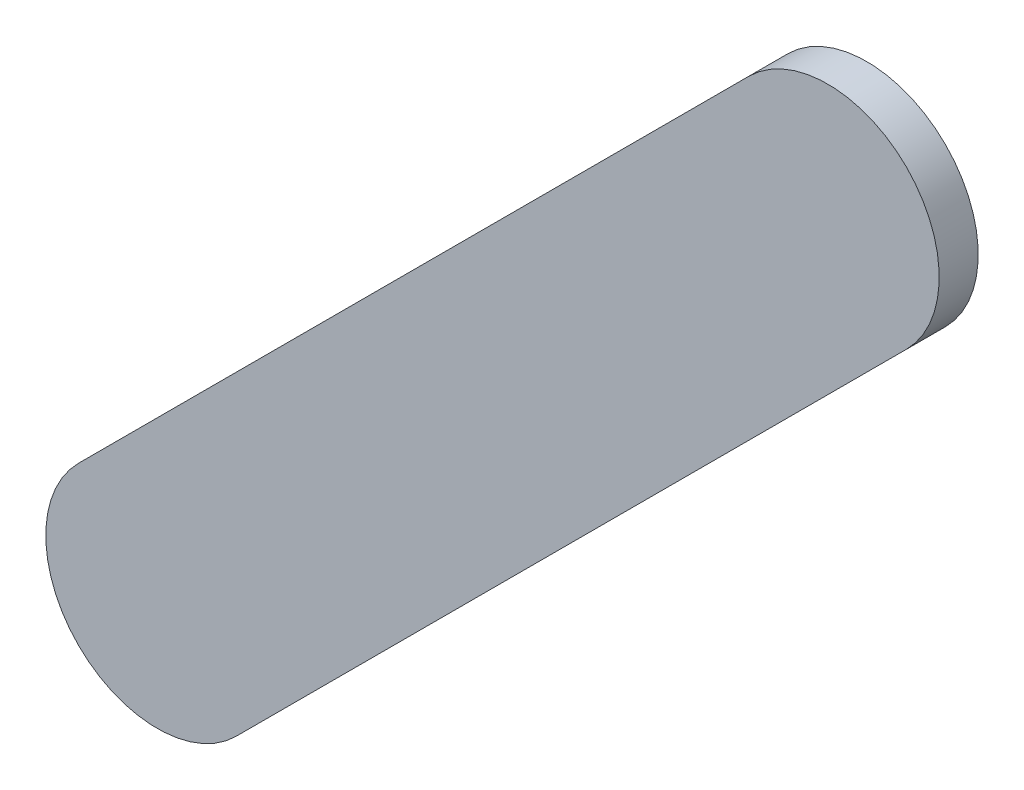
ISO-10303-21;
HEADER;
FILE_DESCRIPTION(('STEP AP214'),'2;1');
FILE_NAME('part.step','',(''),(''),'','','');
FILE_SCHEMA(('AUTOMOTIVE_DESIGN { 1 0 10303 214 1 1 1 1 }'));
ENDSEC;
DATA;
#1=APPLICATION_CONTEXT('core data for automotive mechanical design processes');
#2=APPLICATION_PROTOCOL_DEFINITION('international standard','automotive_design',2000,#1);
#3=PRODUCT_CONTEXT('',#1,'mechanical');
#4=PRODUCT('Part','Part','',(#3));
#5=PRODUCT_RELATED_PRODUCT_CATEGORY('part','',(#4));
#6=PRODUCT_DEFINITION_FORMATION('','',#4);
#7=PRODUCT_DEFINITION_CONTEXT('part definition',#1,'design');
#8=PRODUCT_DEFINITION('design','',#6,#7);
#9=PRODUCT_DEFINITION_SHAPE('','',#8);
#10=(LENGTH_UNIT() NAMED_UNIT(*) SI_UNIT(.MILLI.,.METRE.));
#11=(NAMED_UNIT(*) PLANE_ANGLE_UNIT() SI_UNIT($,.RADIAN.));
#12=(NAMED_UNIT(*) SI_UNIT($,.STERADIAN.) SOLID_ANGLE_UNIT());
#13=UNCERTAINTY_MEASURE_WITH_UNIT(LENGTH_MEASURE(1.E-05),#10,'distance_accuracy_value','');
#14=(GEOMETRIC_REPRESENTATION_CONTEXT(3) GLOBAL_UNCERTAINTY_ASSIGNED_CONTEXT((#13)) GLOBAL_UNIT_ASSIGNED_CONTEXT((#10,
#11,#12)) REPRESENTATION_CONTEXT('',''));
#15=CARTESIAN_POINT('',(0.,0.,0.));
#16=DIRECTION('',(0.,0.,1.));
#17=DIRECTION('',(1.,0.,0.));
#18=AXIS2_PLACEMENT_3D('',#15,#16,#17);
#19=CARTESIAN_POINT('',(92.919238,-124.254415,1.635));
#20=DIRECTION('',(0.,0.,1.));
#21=DIRECTION('',(1.,0.,0.));
#22=AXIS2_PLACEMENT_3D('',#19,#20,#21);
#23=PLANE('',#22);
#24=DIRECTION('',(0.707106781186548,0.707106781186548,0.));
#25=VECTOR('',#24,1.);
#26=CARTESIAN_POINT('',(92.919238,-124.254415,1.635));
#27=LINE('',#26,#25);
#28=CARTESIAN_POINT('',(92.919238,-124.254415,1.635));
#29=VERTEX_POINT('',#28);
#30=CARTESIAN_POINT('',(93.52071,-123.652943,1.635));
#31=VERTEX_POINT('',#30);
#32=EDGE_CURVE('E72',#29,#31,#27,.T.);
#33=ORIENTED_EDGE('',*,*,#32,.T.);
#34=CARTESIAN_POINT('',(93.4499995,-123.5822325,1.635));
#35=DIRECTION('',(0.,0.,1.));
#36=DIRECTION('',(0.707106781187048,-0.707106781186048,0.));
#37=AXIS2_PLACEMENT_3D('',#34,#35,#36);
#38=CIRCLE('',#37,0.09999974810218);
#39=CARTESIAN_POINT('',(93.379289,-123.511522,1.635));
#40=VERTEX_POINT('',#39);
#41=EDGE_CURVE('E70',#31,#40,#38,.T.);
#42=ORIENTED_EDGE('',*,*,#41,.T.);
#43=DIRECTION('',(-0.707106781186548,-0.707106781186548,0.));
#44=VECTOR('',#43,1.);
#45=CARTESIAN_POINT('',(93.379289,-123.511522,1.635));
#46=LINE('',#45,#44);
#47=CARTESIAN_POINT('',(92.777817,-124.112994,1.635));
#48=VERTEX_POINT('',#47);
#49=EDGE_CURVE('E20',#40,#48,#46,.T.);
#50=ORIENTED_EDGE('',*,*,#49,.T.);
#51=CARTESIAN_POINT('',(92.8485275,-124.1837045,1.635));
#52=DIRECTION('',(0.,0.,1.));
#53=DIRECTION('',(-0.707106781186548,0.707106781186548,0.));
#54=AXIS2_PLACEMENT_3D('',#51,#52,#53);
#55=CIRCLE('',#54,0.09999974810218);
#56=EDGE_CURVE('E11',#48,#29,#55,.T.);
#57=ORIENTED_EDGE('',*,*,#56,.T.);
#58=EDGE_LOOP('',(#33,#42,#50,#57));
#59=FACE_BOUND('',#58,.T.);
#60=ADVANCED_FACE('F17',(#59),#23,.T.);
#61=CARTESIAN_POINT('',(92.919238,-124.254415,1.6));
#62=DIRECTION('',(0.,0.,1.));
#63=DIRECTION('',(1.,0.,0.));
#64=AXIS2_PLACEMENT_3D('',#61,#62,#63);
#65=PLANE('',#64);
#66=CARTESIAN_POINT('',(92.8485275,-124.1837045,1.6));
#67=DIRECTION('',(0.,0.,1.));
#68=DIRECTION('',(-0.707106781186548,0.707106781186548,0.));
#69=AXIS2_PLACEMENT_3D('',#66,#67,#68);
#70=CIRCLE('',#69,0.09999974810218);
#71=CARTESIAN_POINT('',(92.777817,-124.112994,1.6));
#72=VERTEX_POINT('',#71);
#73=CARTESIAN_POINT('',(92.919238,-124.254415,1.6));
#74=VERTEX_POINT('',#73);
#75=EDGE_CURVE('E27',#72,#74,#70,.T.);
#76=ORIENTED_EDGE('',*,*,#75,.F.);
#77=DIRECTION('',(-0.707106781186548,-0.707106781186548,0.));
#78=VECTOR('',#77,1.);
#79=CARTESIAN_POINT('',(93.379289,-123.511522,1.6));
#80=LINE('',#79,#78);
#81=CARTESIAN_POINT('',(93.379289,-123.511522,1.6));
#82=VERTEX_POINT('',#81);
#83=EDGE_CURVE('E77',#82,#72,#80,.T.);
#84=ORIENTED_EDGE('',*,*,#83,.F.);
#85=CARTESIAN_POINT('',(93.4499995,-123.5822325,1.6));
#86=DIRECTION('',(0.,0.,1.));
#87=DIRECTION('',(0.707106781187048,-0.707106781186048,0.));
#88=AXIS2_PLACEMENT_3D('',#85,#86,#87);
#89=CIRCLE('',#88,0.09999974810218);
#90=CARTESIAN_POINT('',(93.52071,-123.652943,1.6));
#91=VERTEX_POINT('',#90);
#92=EDGE_CURVE('E81',#91,#82,#89,.T.);
#93=ORIENTED_EDGE('',*,*,#92,.F.);
#94=DIRECTION('',(0.707106781186548,0.707106781186548,0.));
#95=VECTOR('',#94,1.);
#96=CARTESIAN_POINT('',(92.919238,-124.254415,1.6));
#97=LINE('',#96,#95);
#98=EDGE_CURVE('E91',#74,#91,#97,.T.);
#99=ORIENTED_EDGE('',*,*,#98,.F.);
#100=EDGE_LOOP('',(#76,#84,#93,#99));
#101=FACE_BOUND('',#100,.T.);
#102=ADVANCED_FACE('F177',(#101),#65,.F.);
#103=CARTESIAN_POINT('',(92.8485275,-124.1837045,1.6));
#104=DIRECTION('',(0.,0.,-1.));
#105=DIRECTION('',(-0.707106781186548,0.707106781186548,0.));
#106=AXIS2_PLACEMENT_3D('',#103,#104,#105);
#107=CYLINDRICAL_SURFACE('',#106,0.09999974810218);
#108=ORIENTED_EDGE('',*,*,#75,.T.);
#109=DIRECTION('',(0.,0.,1.));
#110=VECTOR('',#109,1.);
#111=CARTESIAN_POINT('',(92.919238,-124.254415,1.6));
#112=LINE('',#111,#110);
#113=EDGE_CURVE('E88',#74,#29,#112,.T.);
#114=ORIENTED_EDGE('',*,*,#113,.T.);
#115=ORIENTED_EDGE('',*,*,#56,.F.);
#116=DIRECTION('',(0.,0.,1.));
#117=VECTOR('',#116,1.);
#118=CARTESIAN_POINT('',(92.777817,-124.112994,1.6));
#119=LINE('',#118,#117);
#120=EDGE_CURVE('E65',#72,#48,#119,.T.);
#121=ORIENTED_EDGE('',*,*,#120,.F.);
#122=EDGE_LOOP('',(#108,#114,#115,#121));
#123=FACE_BOUND('',#122,.T.);
#124=ADVANCED_FACE('F169',(#123),#107,.T.);
#125=CARTESIAN_POINT('',(93.379289,-123.511522,1.6));
#126=DIRECTION('',(0.707106781186548,-0.707106781186548,0.));
#127=DIRECTION('',(0.,0.,-1.));
#128=AXIS2_PLACEMENT_3D('',#125,#126,#127);
#129=PLANE('',#128);
#130=ORIENTED_EDGE('',*,*,#83,.T.);
#131=ORIENTED_EDGE('',*,*,#120,.T.);
#132=ORIENTED_EDGE('',*,*,#49,.F.);
#133=DIRECTION('',(0.,0.,1.));
#134=VECTOR('',#133,1.);
#135=CARTESIAN_POINT('',(93.379289,-123.511522,1.6));
#136=LINE('',#135,#134);
#137=EDGE_CURVE('E63',#82,#40,#136,.T.);
#138=ORIENTED_EDGE('',*,*,#137,.F.);
#139=EDGE_LOOP('',(#130,#131,#132,#138));
#140=FACE_BOUND('',#139,.T.);
#141=ADVANCED_FACE('F61',(#140),#129,.F.);
#142=CARTESIAN_POINT('',(93.4499995,-123.5822325,1.6));
#143=DIRECTION('',(0.,0.,-1.));
#144=DIRECTION('',(0.707106781187048,-0.707106781186048,0.));
#145=AXIS2_PLACEMENT_3D('',#142,#143,#144);
#146=CYLINDRICAL_SURFACE('',#145,0.09999974810218);
#147=ORIENTED_EDGE('',*,*,#92,.T.);
#148=ORIENTED_EDGE('',*,*,#137,.T.);
#149=ORIENTED_EDGE('',*,*,#41,.F.);
#150=DIRECTION('',(0.,0.,1.));
#151=VECTOR('',#150,1.);
#152=CARTESIAN_POINT('',(93.52071,-123.652943,1.6));
#153=LINE('',#152,#151);
#154=EDGE_CURVE('E95',#91,#31,#153,.T.);
#155=ORIENTED_EDGE('',*,*,#154,.F.);
#156=EDGE_LOOP('',(#147,#148,#149,#155));
#157=FACE_BOUND('',#156,.T.);
#158=ADVANCED_FACE('F79',(#157),#146,.T.);
#159=CARTESIAN_POINT('',(92.919238,-124.254415,1.6));
#160=DIRECTION('',(-0.707106781186548,0.707106781186548,0.));
#161=DIRECTION('',(0.,0.,1.));
#162=AXIS2_PLACEMENT_3D('',#159,#160,#161);
#163=PLANE('',#162);
#164=ORIENTED_EDGE('',*,*,#98,.T.);
#165=ORIENTED_EDGE('',*,*,#154,.T.);
#166=ORIENTED_EDGE('',*,*,#32,.F.);
#167=ORIENTED_EDGE('',*,*,#113,.F.);
#168=EDGE_LOOP('',(#164,#165,#166,#167));
#169=FACE_BOUND('',#168,.T.);
#170=ADVANCED_FACE('F144',(#169),#163,.F.);
#171=CLOSED_SHELL('',(#60,#102,#124,#141,#158,#170));
#172=MANIFOLD_SOLID_BREP('B1',#171);
#173=ADVANCED_BREP_SHAPE_REPRESENTATION('',(#18,#172),#14);
#174=SHAPE_DEFINITION_REPRESENTATION(#9,#173);
ENDSEC;
END-ISO-10303-21;
